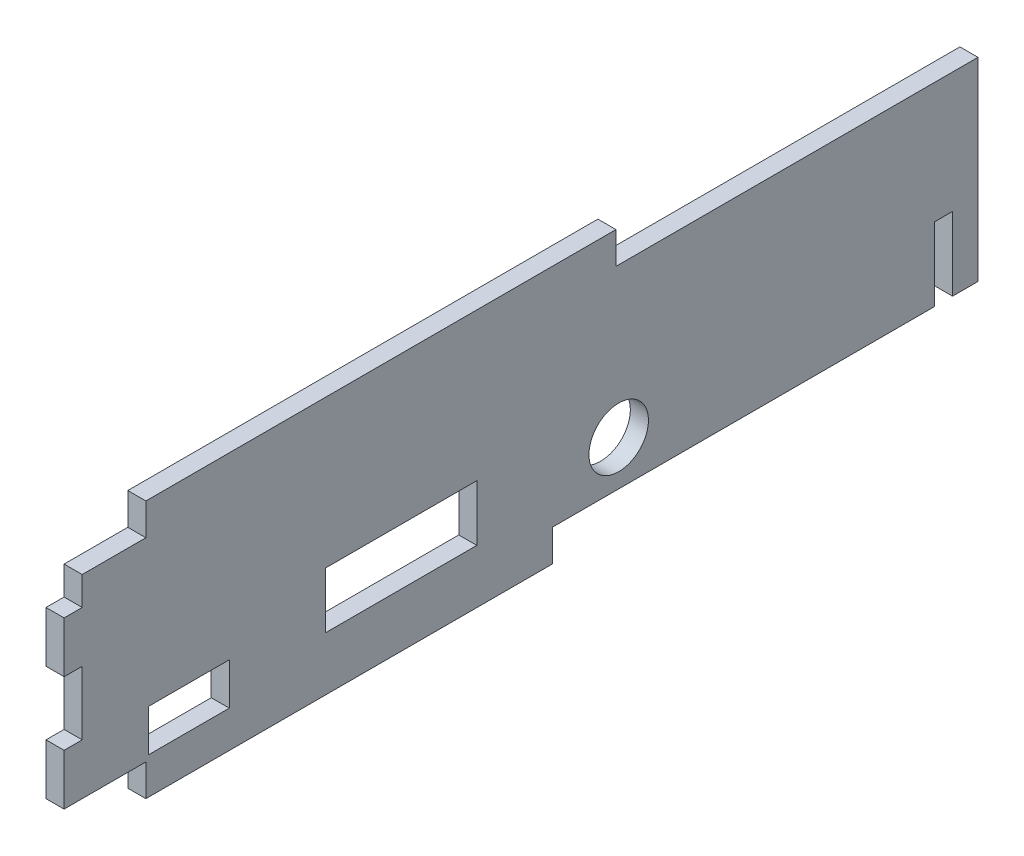
ISO-10303-21;
HEADER;
FILE_DESCRIPTION(('STEP AP214'),'2;1');
FILE_NAME('part.step','',(''),(''),'','','');
FILE_SCHEMA(('AUTOMOTIVE_DESIGN { 1 0 10303 214 1 1 1 1 }'));
ENDSEC;
DATA;
#1=APPLICATION_CONTEXT('core data for automotive mechanical design processes');
#2=APPLICATION_PROTOCOL_DEFINITION('international standard','automotive_design',2000,#1);
#3=PRODUCT_CONTEXT('',#1,'mechanical');
#4=PRODUCT('Part','Part','',(#3));
#5=PRODUCT_RELATED_PRODUCT_CATEGORY('part','',(#4));
#6=PRODUCT_DEFINITION_FORMATION('','',#4);
#7=PRODUCT_DEFINITION_CONTEXT('part definition',#1,'design');
#8=PRODUCT_DEFINITION('design','',#6,#7);
#9=PRODUCT_DEFINITION_SHAPE('','',#8);
#10=(LENGTH_UNIT() NAMED_UNIT(*) SI_UNIT(.MILLI.,.METRE.));
#11=(NAMED_UNIT(*) PLANE_ANGLE_UNIT() SI_UNIT($,.RADIAN.));
#12=(NAMED_UNIT(*) SI_UNIT($,.STERADIAN.) SOLID_ANGLE_UNIT());
#13=UNCERTAINTY_MEASURE_WITH_UNIT(LENGTH_MEASURE(1.E-05),#10,'distance_accuracy_value','');
#14=(GEOMETRIC_REPRESENTATION_CONTEXT(3) GLOBAL_UNCERTAINTY_ASSIGNED_CONTEXT((#13)) GLOBAL_UNIT_ASSIGNED_CONTEXT((#10,
#11,#12)) REPRESENTATION_CONTEXT('',''));
#15=CARTESIAN_POINT('',(0.,0.,0.));
#16=DIRECTION('',(0.,0.,1.));
#17=DIRECTION('',(1.,0.,0.));
#18=AXIS2_PLACEMENT_3D('',#15,#16,#17);
#19=CARTESIAN_POINT('',(1.8034,9.3853,0.));
#20=DIRECTION('',(0.,1.,0.));
#21=DIRECTION('',(0.,0.,1.));
#22=AXIS2_PLACEMENT_3D('',#19,#20,#21);
#23=PLANE('',#22);
#24=DIRECTION('',(0.,0.,-1.));
#25=VECTOR('',#24,1.);
#26=CARTESIAN_POINT('',(0.,9.3853,0.));
#27=LINE('',#26,#25);
#28=CARTESIAN_POINT('',(0.,9.3853,-6.6294));
#29=VERTEX_POINT('',#28);
#30=CARTESIAN_POINT('',(0.,9.3853,-14.6685));
#31=VERTEX_POINT('',#30);
#32=EDGE_CURVE('E338',#29,#31,#27,.T.);
#33=ORIENTED_EDGE('',*,*,#32,.T.);
#34=DIRECTION('',(-1.,0.,0.));
#35=VECTOR('',#34,1.);
#36=CARTESIAN_POINT('',(1.8034,9.3853,-14.6685));
#37=LINE('',#36,#35);
#38=CARTESIAN_POINT('',(1.8034,9.3853,-14.6685));
#39=VERTEX_POINT('',#38);
#40=EDGE_CURVE('E11',#39,#31,#37,.T.);
#41=ORIENTED_EDGE('',*,*,#40,.F.);
#42=DIRECTION('',(0.,0.,-1.));
#43=VECTOR('',#42,1.);
#44=CARTESIAN_POINT('',(1.8034,9.3853,0.));
#45=LINE('',#44,#43);
#46=CARTESIAN_POINT('',(1.8034,9.3853,-6.6294));
#47=VERTEX_POINT('',#46);
#48=EDGE_CURVE('E244',#47,#39,#45,.T.);
#49=ORIENTED_EDGE('',*,*,#48,.F.);
#50=DIRECTION('',(-1.,0.,0.));
#51=VECTOR('',#50,1.);
#52=CARTESIAN_POINT('',(1.8034,9.3853,-6.6294));
#53=LINE('',#52,#51);
#54=EDGE_CURVE('E52',#47,#29,#53,.T.);
#55=ORIENTED_EDGE('',*,*,#54,.T.);
#56=EDGE_LOOP('',(#33,#41,#49,#55));
#57=FACE_BOUND('',#56,.T.);
#58=ADVANCED_FACE('F33',(#57),#23,.F.);
#59=CARTESIAN_POINT('',(1.8034,0.,-14.6685));
#60=DIRECTION('',(0.,0.,-1.));
#61=DIRECTION('',(0.,1.,0.));
#62=AXIS2_PLACEMENT_3D('',#59,#60,#61);
#63=PLANE('',#62);
#64=DIRECTION('',(0.,-1.,0.));
#65=VECTOR('',#64,1.);
#66=CARTESIAN_POINT('',(0.,0.,-14.6685));
#67=LINE('',#66,#65);
#68=CARTESIAN_POINT('',(0.,5.207,-14.6685));
#69=VERTEX_POINT('',#68);
#70=EDGE_CURVE('E250',#31,#69,#67,.T.);
#71=ORIENTED_EDGE('',*,*,#70,.T.);
#72=DIRECTION('',(-1.,0.,0.));
#73=VECTOR('',#72,1.);
#74=CARTESIAN_POINT('',(1.8034,5.207,-14.6685));
#75=LINE('',#74,#73);
#76=CARTESIAN_POINT('',(1.8034,5.207,-14.6685));
#77=VERTEX_POINT('',#76);
#78=EDGE_CURVE('E43',#77,#69,#75,.T.);
#79=ORIENTED_EDGE('',*,*,#78,.F.);
#80=DIRECTION('',(0.,-1.,0.));
#81=VECTOR('',#80,1.);
#82=CARTESIAN_POINT('',(1.8034,0.,-14.6685));
#83=LINE('',#82,#81);
#84=EDGE_CURVE('E238',#39,#77,#83,.T.);
#85=ORIENTED_EDGE('',*,*,#84,.F.);
#86=ORIENTED_EDGE('',*,*,#40,.T.);
#87=EDGE_LOOP('',(#71,#79,#85,#86));
#88=FACE_BOUND('',#87,.T.);
#89=ADVANCED_FACE('F249',(#88),#63,.F.);
#90=CARTESIAN_POINT('',(1.8034,5.207,0.));
#91=DIRECTION('',(0.,1.,0.));
#92=DIRECTION('',(0.,0.,1.));
#93=AXIS2_PLACEMENT_3D('',#90,#91,#92);
#94=PLANE('',#93);
#95=DIRECTION('',(0.,0.,-1.));
#96=VECTOR('',#95,1.);
#97=CARTESIAN_POINT('',(0.,5.207,0.));
#98=LINE('',#97,#96);
#99=CARTESIAN_POINT('',(0.,5.207,-6.6294));
#100=VERTEX_POINT('',#99);
#101=EDGE_CURVE('E341',#100,#69,#98,.T.);
#102=ORIENTED_EDGE('',*,*,#101,.F.);
#103=DIRECTION('',(-1.,0.,0.));
#104=VECTOR('',#103,1.);
#105=CARTESIAN_POINT('',(1.8034,5.207,-6.6294));
#106=LINE('',#105,#104);
#107=CARTESIAN_POINT('',(1.8034,5.207,-6.6294));
#108=VERTEX_POINT('',#107);
#109=EDGE_CURVE('E144',#108,#100,#106,.T.);
#110=ORIENTED_EDGE('',*,*,#109,.F.);
#111=DIRECTION('',(0.,0.,-1.));
#112=VECTOR('',#111,1.);
#113=CARTESIAN_POINT('',(1.8034,5.207,0.));
#114=LINE('',#113,#112);
#115=EDGE_CURVE('E243',#108,#77,#114,.T.);
#116=ORIENTED_EDGE('',*,*,#115,.T.);
#117=ORIENTED_EDGE('',*,*,#78,.T.);
#118=EDGE_LOOP('',(#102,#110,#116,#117));
#119=FACE_BOUND('',#118,.T.);
#120=ADVANCED_FACE('F254',(#119),#94,.T.);
#121=CARTESIAN_POINT('',(1.8034,0.,-39.3446));
#122=DIRECTION('',(0.,0.,1.));
#123=DIRECTION('',(0.,-1.,0.));
#124=AXIS2_PLACEMENT_3D('',#121,#122,#123);
#125=PLANE('',#124);
#126=DIRECTION('',(0.,1.,0.));
#127=VECTOR('',#126,1.);
#128=CARTESIAN_POINT('',(0.,0.,-39.3446));
#129=LINE('',#128,#127);
#130=CARTESIAN_POINT('',(0.,6.9215,-39.3446));
#131=VERTEX_POINT('',#130);
#132=CARTESIAN_POINT('',(0.,12.5095,-39.3446));
#133=VERTEX_POINT('',#132);
#134=EDGE_CURVE('E326',#131,#133,#129,.T.);
#135=ORIENTED_EDGE('',*,*,#134,.F.);
#136=DIRECTION('',(-1.,0.,0.));
#137=VECTOR('',#136,1.);
#138=CARTESIAN_POINT('',(1.8034,6.9215,-39.3446));
#139=LINE('',#138,#137);
#140=CARTESIAN_POINT('',(1.8034,6.9215,-39.3446));
#141=VERTEX_POINT('',#140);
#142=EDGE_CURVE('E348',#141,#131,#139,.T.);
#143=ORIENTED_EDGE('',*,*,#142,.F.);
#144=DIRECTION('',(0.,1.,0.));
#145=VECTOR('',#144,1.);
#146=CARTESIAN_POINT('',(1.8034,0.,-39.3446));
#147=LINE('',#146,#145);
#148=CARTESIAN_POINT('',(1.8034,12.5095,-39.3446));
#149=VERTEX_POINT('',#148);
#150=EDGE_CURVE('E838',#141,#149,#147,.T.);
#151=ORIENTED_EDGE('',*,*,#150,.T.);
#152=DIRECTION('',(-1.,0.,0.));
#153=VECTOR('',#152,1.);
#154=CARTESIAN_POINT('',(1.8034,12.5095,-39.3446));
#155=LINE('',#154,#153);
#156=EDGE_CURVE('E350',#149,#133,#155,.T.);
#157=ORIENTED_EDGE('',*,*,#156,.T.);
#158=EDGE_LOOP('',(#135,#143,#151,#157));
#159=FACE_BOUND('',#158,.T.);
#160=ADVANCED_FACE('F543',(#159),#125,.T.);
#161=CARTESIAN_POINT('',(1.8034,6.9215,0.));
#162=DIRECTION('',(0.,1.,0.));
#163=DIRECTION('',(0.,0.,1.));
#164=AXIS2_PLACEMENT_3D('',#161,#162,#163);
#165=PLANE('',#164);
#166=DIRECTION('',(0.,0.,-1.));
#167=VECTOR('',#166,1.);
#168=CARTESIAN_POINT('',(0.,6.9215,0.));
#169=LINE('',#168,#167);
#170=CARTESIAN_POINT('',(0.,6.9215,-24.257));
#171=VERTEX_POINT('',#170);
#172=EDGE_CURVE('E329',#171,#131,#169,.T.);
#173=ORIENTED_EDGE('',*,*,#172,.F.);
#174=DIRECTION('',(-1.,0.,0.));
#175=VECTOR('',#174,1.);
#176=CARTESIAN_POINT('',(1.8034,6.9215,-24.257));
#177=LINE('',#176,#175);
#178=CARTESIAN_POINT('',(1.8034,6.9215,-24.257));
#179=VERTEX_POINT('',#178);
#180=EDGE_CURVE('E355',#179,#171,#177,.T.);
#181=ORIENTED_EDGE('',*,*,#180,.F.);
#182=DIRECTION('',(0.,0.,-1.));
#183=VECTOR('',#182,1.);
#184=CARTESIAN_POINT('',(1.8034,6.9215,0.));
#185=LINE('',#184,#183);
#186=EDGE_CURVE('E841',#179,#141,#185,.T.);
#187=ORIENTED_EDGE('',*,*,#186,.T.);
#188=ORIENTED_EDGE('',*,*,#142,.T.);
#189=EDGE_LOOP('',(#173,#181,#187,#188));
#190=FACE_BOUND('',#189,.T.);
#191=ADVANCED_FACE('F539',(#190),#165,.T.);
#192=CARTESIAN_POINT('',(1.8034,0.,-24.257));
#193=DIRECTION('',(0.,0.,1.));
#194=DIRECTION('',(0.,-1.,0.));
#195=AXIS2_PLACEMENT_3D('',#192,#193,#194);
#196=PLANE('',#195);
#197=DIRECTION('',(0.,1.,0.));
#198=VECTOR('',#197,1.);
#199=CARTESIAN_POINT('',(0.,0.,-24.257));
#200=LINE('',#199,#198);
#201=CARTESIAN_POINT('',(0.,12.5095,-24.257));
#202=VERTEX_POINT('',#201);
#203=EDGE_CURVE('E332',#171,#202,#200,.T.);
#204=ORIENTED_EDGE('',*,*,#203,.T.);
#205=DIRECTION('',(-1.,0.,0.));
#206=VECTOR('',#205,1.);
#207=CARTESIAN_POINT('',(1.8034,12.5095,-24.257));
#208=LINE('',#207,#206);
#209=CARTESIAN_POINT('',(1.8034,12.5095,-24.257));
#210=VERTEX_POINT('',#209);
#211=EDGE_CURVE('E352',#210,#202,#208,.T.);
#212=ORIENTED_EDGE('',*,*,#211,.F.);
#213=DIRECTION('',(0.,1.,0.));
#214=VECTOR('',#213,1.);
#215=CARTESIAN_POINT('',(1.8034,0.,-24.257));
#216=LINE('',#215,#214);
#217=EDGE_CURVE('E849',#179,#210,#216,.T.);
#218=ORIENTED_EDGE('',*,*,#217,.F.);
#219=ORIENTED_EDGE('',*,*,#180,.T.);
#220=EDGE_LOOP('',(#204,#212,#218,#219));
#221=FACE_BOUND('',#220,.T.);
#222=ADVANCED_FACE('F536',(#221),#196,.F.);
#223=CARTESIAN_POINT('',(1.8034,4.7244,0.));
#224=DIRECTION('',(0.,-1.,0.));
#225=DIRECTION('',(0.,0.,-1.));
#226=AXIS2_PLACEMENT_3D('',#223,#224,#225);
#227=PLANE('',#226);
#228=DIRECTION('',(0.,0.,1.));
#229=VECTOR('',#228,1.);
#230=CARTESIAN_POINT('',(0.,4.7244,0.));
#231=LINE('',#230,#229);
#232=CARTESIAN_POINT('',(0.,4.7244,-6.35));
#233=VERTEX_POINT('',#232);
#234=CARTESIAN_POINT('',(0.,4.72439999999999,1.8034));
#235=VERTEX_POINT('',#234);
#236=EDGE_CURVE('E264',#233,#235,#231,.T.);
#237=ORIENTED_EDGE('',*,*,#236,.F.);
#238=DIRECTION('',(-1.,0.,0.));
#239=VECTOR('',#238,1.);
#240=CARTESIAN_POINT('',(1.8034,4.7244,-6.35));
#241=LINE('',#240,#239);
#242=CARTESIAN_POINT('',(1.8034,4.7244,-6.35));
#243=VERTEX_POINT('',#242);
#244=EDGE_CURVE('E37',#243,#233,#241,.T.);
#245=ORIENTED_EDGE('',*,*,#244,.F.);
#246=DIRECTION('',(0.,0.,1.));
#247=VECTOR('',#246,1.);
#248=CARTESIAN_POINT('',(1.8034,4.7244,0.));
#249=LINE('',#248,#247);
#250=CARTESIAN_POINT('',(1.8034,4.72439999999999,1.8034));
#251=VERTEX_POINT('',#250);
#252=EDGE_CURVE('E420',#243,#251,#249,.T.);
#253=ORIENTED_EDGE('',*,*,#252,.T.);
#254=DIRECTION('',(-1.,0.,0.));
#255=VECTOR('',#254,1.);
#256=CARTESIAN_POINT('',(1.8034,4.72439999999999,1.8034));
#257=LINE('',#256,#255);
#258=EDGE_CURVE('E257',#251,#235,#257,.T.);
#259=ORIENTED_EDGE('',*,*,#258,.T.);
#260=EDGE_LOOP('',(#237,#245,#253,#259));
#261=FACE_BOUND('',#260,.T.);
#262=ADVANCED_FACE('F418',(#261),#227,.T.);
#263=CARTESIAN_POINT('',(1.8034,0.,-6.35));
#264=DIRECTION('',(0.,0.,-1.));
#265=DIRECTION('',(-1.,0.,0.));
#266=AXIS2_PLACEMENT_3D('',#263,#264,#265);
#267=PLANE('',#266);
#268=DIRECTION('',(0.,-1.,0.));
#269=VECTOR('',#268,1.);
#270=CARTESIAN_POINT('',(0.,0.,-6.35));
#271=LINE('',#270,#269);
#272=CARTESIAN_POINT('',(0.,1.5494,-6.35));
#273=VERTEX_POINT('',#272);
#274=EDGE_CURVE('E267',#233,#273,#271,.T.);
#275=ORIENTED_EDGE('',*,*,#274,.T.);
#276=DIRECTION('',(-1.,0.,0.));
#277=VECTOR('',#276,1.);
#278=CARTESIAN_POINT('',(1.8034,1.5494,-6.35));
#279=LINE('',#278,#277);
#280=CARTESIAN_POINT('',(1.8034,1.5494,-6.35));
#281=VERTEX_POINT('',#280);
#282=EDGE_CURVE('E404',#281,#273,#279,.T.);
#283=ORIENTED_EDGE('',*,*,#282,.F.);
#284=DIRECTION('',(0.,-1.,0.));
#285=VECTOR('',#284,1.);
#286=CARTESIAN_POINT('',(1.8034,0.,-6.35));
#287=LINE('',#286,#285);
#288=EDGE_CURVE('E412',#243,#281,#287,.T.);
#289=ORIENTED_EDGE('',*,*,#288,.F.);
#290=ORIENTED_EDGE('',*,*,#244,.T.);
#291=EDGE_LOOP('',(#275,#283,#289,#290));
#292=FACE_BOUND('',#291,.T.);
#293=ADVANCED_FACE('F410',(#292),#267,.F.);
#294=CARTESIAN_POINT('',(1.8034,1.5494,0.));
#295=DIRECTION('',(0.,1.,0.));
#296=DIRECTION('',(0.,0.,1.));
#297=AXIS2_PLACEMENT_3D('',#294,#295,#296);
#298=PLANE('',#297);
#299=DIRECTION('',(0.,0.,-1.));
#300=VECTOR('',#299,1.);
#301=CARTESIAN_POINT('',(0.,1.5494,0.));
#302=LINE('',#301,#300);
#303=CARTESIAN_POINT('',(0.,1.5494,-46.863));
#304=VERTEX_POINT('',#303);
#305=EDGE_CURVE('E270',#273,#304,#302,.T.);
#306=ORIENTED_EDGE('',*,*,#305,.T.);
#307=DIRECTION('',(-1.,0.,0.));
#308=VECTOR('',#307,1.);
#309=CARTESIAN_POINT('',(1.8034,1.5494,-46.863));
#310=LINE('',#309,#308);
#311=CARTESIAN_POINT('',(1.8034,1.5494,-46.863));
#312=VERTEX_POINT('',#311);
#313=EDGE_CURVE('E402',#312,#304,#310,.T.);
#314=ORIENTED_EDGE('',*,*,#313,.F.);
#315=DIRECTION('',(0.,0.,-1.));
#316=VECTOR('',#315,1.);
#317=CARTESIAN_POINT('',(1.8034,1.5494,0.));
#318=LINE('',#317,#316);
#319=EDGE_CURVE('E881',#281,#312,#318,.T.);
#320=ORIENTED_EDGE('',*,*,#319,.F.);
#321=ORIENTED_EDGE('',*,*,#282,.T.);
#322=EDGE_LOOP('',(#306,#314,#320,#321));
#323=FACE_BOUND('',#322,.T.);
#324=ADVANCED_FACE('F515',(#323),#298,.F.);
#325=CARTESIAN_POINT('',(1.8034,0.,-46.863));
#326=DIRECTION('',(0.,0.,1.));
#327=DIRECTION('',(1.,0.,0.));
#328=AXIS2_PLACEMENT_3D('',#325,#326,#327);
#329=PLANE('',#328);
#330=DIRECTION('',(0.,1.,0.));
#331=VECTOR('',#330,1.);
#332=CARTESIAN_POINT('',(0.,0.,-46.863));
#333=LINE('',#332,#331);
#334=CARTESIAN_POINT('',(0.,4.7244,-46.863));
#335=VERTEX_POINT('',#334);
#336=EDGE_CURVE('E273',#304,#335,#333,.T.);
#337=ORIENTED_EDGE('',*,*,#336,.T.);
#338=DIRECTION('',(-1.,0.,0.));
#339=VECTOR('',#338,1.);
#340=CARTESIAN_POINT('',(1.8034,4.7244,-46.863));
#341=LINE('',#340,#339);
#342=CARTESIAN_POINT('',(1.8034,4.7244,-46.863));
#343=VERTEX_POINT('',#342);
#344=EDGE_CURVE('E399',#343,#335,#341,.T.);
#345=ORIENTED_EDGE('',*,*,#344,.F.);
#346=DIRECTION('',(0.,1.,0.));
#347=VECTOR('',#346,1.);
#348=CARTESIAN_POINT('',(1.8034,0.,-46.863));
#349=LINE('',#348,#347);
#350=EDGE_CURVE('E513',#312,#343,#349,.T.);
#351=ORIENTED_EDGE('',*,*,#350,.F.);
#352=ORIENTED_EDGE('',*,*,#313,.T.);
#353=EDGE_LOOP('',(#337,#345,#351,#352));
#354=FACE_BOUND('',#353,.T.);
#355=ADVANCED_FACE('F511',(#354),#329,.F.);
#356=CARTESIAN_POINT('',(1.8034,4.7244,0.));
#357=DIRECTION('',(0.,1.,0.));
#358=DIRECTION('',(0.,0.,1.));
#359=AXIS2_PLACEMENT_3D('',#356,#357,#358);
#360=PLANE('',#359);
#361=DIRECTION('',(0.,0.,-1.));
#362=VECTOR('',#361,1.);
#363=CARTESIAN_POINT('',(0.,4.7244,0.));
#364=LINE('',#363,#362);
#365=CARTESIAN_POINT('',(0.,4.7244,-84.963));
#366=VERTEX_POINT('',#365);
#367=EDGE_CURVE('E276',#335,#366,#364,.T.);
#368=ORIENTED_EDGE('',*,*,#367,.T.);
#369=DIRECTION('',(-1.,0.,0.));
#370=VECTOR('',#369,1.);
#371=CARTESIAN_POINT('',(1.8034,4.7244,-84.963));
#372=LINE('',#371,#370);
#373=CARTESIAN_POINT('',(1.8034,4.7244,-84.963));
#374=VERTEX_POINT('',#373);
#375=EDGE_CURVE('E397',#374,#366,#372,.T.);
#376=ORIENTED_EDGE('',*,*,#375,.F.);
#377=DIRECTION('',(0.,0.,-1.));
#378=VECTOR('',#377,1.);
#379=CARTESIAN_POINT('',(1.8034,4.7244,0.));
#380=LINE('',#379,#378);
#381=EDGE_CURVE('E878',#343,#374,#380,.T.);
#382=ORIENTED_EDGE('',*,*,#381,.F.);
#383=ORIENTED_EDGE('',*,*,#344,.T.);
#384=EDGE_LOOP('',(#368,#376,#382,#383));
#385=FACE_BOUND('',#384,.T.);
#386=ADVANCED_FACE('F507',(#385),#360,.F.);
#387=CARTESIAN_POINT('',(1.8034,0.,-84.963));
#388=DIRECTION('',(0.,0.,-1.));
#389=DIRECTION('',(-1.,0.,0.));
#390=AXIS2_PLACEMENT_3D('',#387,#388,#389);
#391=PLANE('',#390);
#392=DIRECTION('',(0.,-1.,0.));
#393=VECTOR('',#392,1.);
#394=CARTESIAN_POINT('',(0.,0.,-84.963));
#395=LINE('',#394,#393);
#396=CARTESIAN_POINT('',(0.,12.0396,-84.963));
#397=VERTEX_POINT('',#396);
#398=EDGE_CURVE('E279',#397,#366,#395,.T.);
#399=ORIENTED_EDGE('',*,*,#398,.F.);
#400=DIRECTION('',(-1.,0.,0.));
#401=VECTOR('',#400,1.);
#402=CARTESIAN_POINT('',(1.8034,12.0396,-84.963));
#403=LINE('',#402,#401);
#404=CARTESIAN_POINT('',(1.8034,12.0396,-84.963));
#405=VERTEX_POINT('',#404);
#406=EDGE_CURVE('E395',#405,#397,#403,.T.);
#407=ORIENTED_EDGE('',*,*,#406,.F.);
#408=DIRECTION('',(0.,-1.,0.));
#409=VECTOR('',#408,1.);
#410=CARTESIAN_POINT('',(1.8034,0.,-84.963));
#411=LINE('',#410,#409);
#412=EDGE_CURVE('E505',#405,#374,#411,.T.);
#413=ORIENTED_EDGE('',*,*,#412,.T.);
#414=ORIENTED_EDGE('',*,*,#375,.T.);
#415=EDGE_LOOP('',(#399,#407,#413,#414));
#416=FACE_BOUND('',#415,.T.);
#417=ADVANCED_FACE('F500',(#416),#391,.T.);
#418=CARTESIAN_POINT('',(1.8034,12.0396,0.));
#419=DIRECTION('',(0.,1.,0.));
#420=DIRECTION('',(0.,0.,1.));
#421=AXIS2_PLACEMENT_3D('',#418,#419,#420);
#422=PLANE('',#421);
#423=DIRECTION('',(0.,0.,-1.));
#424=VECTOR('',#423,1.);
#425=CARTESIAN_POINT('',(0.,12.0396,0.));
#426=LINE('',#425,#424);
#427=CARTESIAN_POINT('',(0.,12.0396,-86.7664));
#428=VERTEX_POINT('',#427);
#429=EDGE_CURVE('E282',#397,#428,#426,.T.);
#430=ORIENTED_EDGE('',*,*,#429,.T.);
#431=DIRECTION('',(-1.,0.,0.));
#432=VECTOR('',#431,1.);
#433=CARTESIAN_POINT('',(1.8034,12.0396,-86.7664));
#434=LINE('',#433,#432);
#435=CARTESIAN_POINT('',(1.8034,12.0396,-86.7664));
#436=VERTEX_POINT('',#435);
#437=EDGE_CURVE('E392',#436,#428,#434,.T.);
#438=ORIENTED_EDGE('',*,*,#437,.F.);
#439=DIRECTION('',(0.,0.,-1.));
#440=VECTOR('',#439,1.);
#441=CARTESIAN_POINT('',(1.8034,12.0396,0.));
#442=LINE('',#441,#440);
#443=EDGE_CURVE('E874',#405,#436,#442,.T.);
#444=ORIENTED_EDGE('',*,*,#443,.F.);
#445=ORIENTED_EDGE('',*,*,#406,.T.);
#446=EDGE_LOOP('',(#430,#438,#444,#445));
#447=FACE_BOUND('',#446,.T.);
#448=ADVANCED_FACE('F575',(#447),#422,.F.);
#449=CARTESIAN_POINT('',(1.8034,0.,-86.7664));
#450=DIRECTION('',(0.,0.,-1.));
#451=DIRECTION('',(0.,1.,0.));
#452=AXIS2_PLACEMENT_3D('',#449,#450,#451);
#453=PLANE('',#452);
#454=DIRECTION('',(0.,-1.,0.));
#455=VECTOR('',#454,1.);
#456=CARTESIAN_POINT('',(0.,0.,-86.7664));
#457=LINE('',#456,#455);
#458=CARTESIAN_POINT('',(0.,4.72440000000001,-86.7664));
#459=VERTEX_POINT('',#458);
#460=EDGE_CURVE('E285',#428,#459,#457,.T.);
#461=ORIENTED_EDGE('',*,*,#460,.T.);
#462=DIRECTION('',(-1.,0.,0.));
#463=VECTOR('',#462,1.);
#464=CARTESIAN_POINT('',(1.8034,4.72440000000001,-86.7664));
#465=LINE('',#464,#463);
#466=CARTESIAN_POINT('',(1.8034,4.72440000000001,-86.7664));
#467=VERTEX_POINT('',#466);
#468=EDGE_CURVE('E389',#467,#459,#465,.T.);
#469=ORIENTED_EDGE('',*,*,#468,.F.);
#470=DIRECTION('',(0.,-1.,0.));
#471=VECTOR('',#470,1.);
#472=CARTESIAN_POINT('',(1.8034,0.,-86.7664));
#473=LINE('',#472,#471);
#474=EDGE_CURVE('E872',#436,#467,#473,.T.);
#475=ORIENTED_EDGE('',*,*,#474,.F.);
#476=ORIENTED_EDGE('',*,*,#437,.T.);
#477=EDGE_LOOP('',(#461,#469,#475,#476));
#478=FACE_BOUND('',#477,.T.);
#479=ADVANCED_FACE('F494',(#478),#453,.F.);
#480=CARTESIAN_POINT('',(1.8034,4.72440000000001,0.));
#481=DIRECTION('',(0.,1.,0.));
#482=DIRECTION('',(0.,0.,1.));
#483=AXIS2_PLACEMENT_3D('',#480,#481,#482);
#484=PLANE('',#483);
#485=DIRECTION('',(0.,0.,-1.));
#486=VECTOR('',#485,1.);
#487=CARTESIAN_POINT('',(0.,4.72440000000001,0.));
#488=LINE('',#487,#486);
#489=CARTESIAN_POINT('',(0.,4.72440000000001,-89.3064));
#490=VERTEX_POINT('',#489);
#491=EDGE_CURVE('E288',#459,#490,#488,.T.);
#492=ORIENTED_EDGE('',*,*,#491,.T.);
#493=DIRECTION('',(-1.,0.,0.));
#494=VECTOR('',#493,1.);
#495=CARTESIAN_POINT('',(1.8034,4.72440000000001,-89.3064));
#496=LINE('',#495,#494);
#497=CARTESIAN_POINT('',(1.8034,4.72440000000001,-89.3064));
#498=VERTEX_POINT('',#497);
#499=EDGE_CURVE('E387',#498,#490,#496,.T.);
#500=ORIENTED_EDGE('',*,*,#499,.F.);
#501=DIRECTION('',(0.,0.,-1.));
#502=VECTOR('',#501,1.);
#503=CARTESIAN_POINT('',(1.8034,4.72440000000001,0.));
#504=LINE('',#503,#502);
#505=EDGE_CURVE('E491',#467,#498,#504,.T.);
#506=ORIENTED_EDGE('',*,*,#505,.F.);
#507=ORIENTED_EDGE('',*,*,#468,.T.);
#508=EDGE_LOOP('',(#492,#500,#506,#507));
#509=FACE_BOUND('',#508,.T.);
#510=ADVANCED_FACE('F489',(#509),#484,.F.);
#511=CARTESIAN_POINT('',(1.8034,0.,-89.3064));
#512=DIRECTION('',(0.,0.,-1.));
#513=DIRECTION('',(-1.,0.,0.));
#514=AXIS2_PLACEMENT_3D('',#511,#512,#513);
#515=PLANE('',#514);
#516=DIRECTION('',(0.,-1.,0.));
#517=VECTOR('',#516,1.);
#518=CARTESIAN_POINT('',(0.,0.,-89.3064));
#519=LINE('',#518,#517);
#520=CARTESIAN_POINT('',(0.,24.0792,-89.3064));
#521=VERTEX_POINT('',#520);
#522=EDGE_CURVE('E291',#521,#490,#519,.T.);
#523=ORIENTED_EDGE('',*,*,#522,.F.);
#524=DIRECTION('',(-1.,0.,0.));
#525=VECTOR('',#524,1.);
#526=CARTESIAN_POINT('',(1.8034,24.0792,-89.3064));
#527=LINE('',#526,#525);
#528=CARTESIAN_POINT('',(1.8034,24.0792,-89.3064));
#529=VERTEX_POINT('',#528);
#530=EDGE_CURVE('E385',#529,#521,#527,.T.);
#531=ORIENTED_EDGE('',*,*,#530,.F.);
#532=DIRECTION('',(0.,-1.,0.));
#533=VECTOR('',#532,1.);
#534=CARTESIAN_POINT('',(1.8034,0.,-89.3064));
#535=LINE('',#534,#533);
#536=EDGE_CURVE('E487',#529,#498,#535,.T.);
#537=ORIENTED_EDGE('',*,*,#536,.T.);
#538=ORIENTED_EDGE('',*,*,#499,.T.);
#539=EDGE_LOOP('',(#523,#531,#537,#538));
#540=FACE_BOUND('',#539,.T.);
#541=ADVANCED_FACE('F483',(#540),#515,.T.);
#542=CARTESIAN_POINT('',(1.8034,24.0792,0.));
#543=DIRECTION('',(0.,1.,0.));
#544=DIRECTION('',(0.,0.,1.));
#545=AXIS2_PLACEMENT_3D('',#542,#543,#544);
#546=PLANE('',#545);
#547=DIRECTION('',(0.,0.,-1.));
#548=VECTOR('',#547,1.);
#549=CARTESIAN_POINT('',(0.,24.0792,0.));
#550=LINE('',#549,#548);
#551=CARTESIAN_POINT('',(0.,24.0792,-53.213));
#552=VERTEX_POINT('',#551);
#553=EDGE_CURVE('E294',#552,#521,#550,.T.);
#554=ORIENTED_EDGE('',*,*,#553,.F.);
#555=DIRECTION('',(-1.,0.,0.));
#556=VECTOR('',#555,1.);
#557=CARTESIAN_POINT('',(1.8034,24.0792,-53.213));
#558=LINE('',#557,#556);
#559=CARTESIAN_POINT('',(1.8034,24.0792,-53.213));
#560=VERTEX_POINT('',#559);
#561=EDGE_CURVE('E383',#560,#552,#558,.T.);
#562=ORIENTED_EDGE('',*,*,#561,.F.);
#563=DIRECTION('',(0.,0.,-1.));
#564=VECTOR('',#563,1.);
#565=CARTESIAN_POINT('',(1.8034,24.0792,0.));
#566=LINE('',#565,#564);
#567=EDGE_CURVE('E868',#560,#529,#566,.T.);
#568=ORIENTED_EDGE('',*,*,#567,.T.);
#569=ORIENTED_EDGE('',*,*,#530,.T.);
#570=EDGE_LOOP('',(#554,#562,#568,#569));
#571=FACE_BOUND('',#570,.T.);
#572=ADVANCED_FACE('F480',(#571),#546,.T.);
#573=CARTESIAN_POINT('',(1.8034,0.,-53.213));
#574=DIRECTION('',(0.,0.,-1.));
#575=DIRECTION('',(-1.,0.,0.));
#576=AXIS2_PLACEMENT_3D('',#573,#574,#575);
#577=PLANE('',#576);
#578=DIRECTION('',(0.,-1.,0.));
#579=VECTOR('',#578,1.);
#580=CARTESIAN_POINT('',(0.,0.,-53.213));
#581=LINE('',#580,#579);
#582=CARTESIAN_POINT('',(0.,27.2542,-53.213));
#583=VERTEX_POINT('',#582);
#584=EDGE_CURVE('E297',#583,#552,#581,.T.);
#585=ORIENTED_EDGE('',*,*,#584,.F.);
#586=DIRECTION('',(-1.,0.,0.));
#587=VECTOR('',#586,1.);
#588=CARTESIAN_POINT('',(1.8034,27.2542,-53.213));
#589=LINE('',#588,#587);
#590=CARTESIAN_POINT('',(1.8034,27.2542,-53.213));
#591=VERTEX_POINT('',#590);
#592=EDGE_CURVE('E381',#591,#583,#589,.T.);
#593=ORIENTED_EDGE('',*,*,#592,.F.);
#594=DIRECTION('',(0.,-1.,0.));
#595=VECTOR('',#594,1.);
#596=CARTESIAN_POINT('',(1.8034,0.,-53.213));
#597=LINE('',#596,#595);
#598=EDGE_CURVE('E476',#591,#560,#597,.T.);
#599=ORIENTED_EDGE('',*,*,#598,.T.);
#600=ORIENTED_EDGE('',*,*,#561,.T.);
#601=EDGE_LOOP('',(#585,#593,#599,#600));
#602=FACE_BOUND('',#601,.T.);
#603=ADVANCED_FACE('F474',(#602),#577,.T.);
#604=CARTESIAN_POINT('',(1.8034,27.2542,0.));
#605=DIRECTION('',(0.,1.,0.));
#606=DIRECTION('',(0.,0.,1.));
#607=AXIS2_PLACEMENT_3D('',#604,#605,#606);
#608=PLANE('',#607);
#609=DIRECTION('',(0.,0.,-1.));
#610=VECTOR('',#609,1.);
#611=CARTESIAN_POINT('',(0.,27.2542,0.));
#612=LINE('',#611,#610);
#613=CARTESIAN_POINT('',(0.,27.2542,-6.35));
#614=VERTEX_POINT('',#613);
#615=EDGE_CURVE('E301',#614,#583,#612,.T.);
#616=ORIENTED_EDGE('',*,*,#615,.F.);
#617=DIRECTION('',(-1.,0.,0.));
#618=VECTOR('',#617,1.);
#619=CARTESIAN_POINT('',(1.8034,27.2542,-6.35));
#620=LINE('',#619,#618);
#621=CARTESIAN_POINT('',(1.8034,27.2542,-6.35));
#622=VERTEX_POINT('',#621);
#623=EDGE_CURVE('E379',#622,#614,#620,.T.);
#624=ORIENTED_EDGE('',*,*,#623,.F.);
#625=DIRECTION('',(0.,0.,-1.));
#626=VECTOR('',#625,1.);
#627=CARTESIAN_POINT('',(1.8034,27.2542,0.));
#628=LINE('',#627,#626);
#629=EDGE_CURVE('E470',#622,#591,#628,.T.);
#630=ORIENTED_EDGE('',*,*,#629,.T.);
#631=ORIENTED_EDGE('',*,*,#592,.T.);
#632=EDGE_LOOP('',(#616,#624,#630,#631));
#633=FACE_BOUND('',#632,.T.);
#634=ADVANCED_FACE('F467',(#633),#608,.T.);
#635=CARTESIAN_POINT('',(1.8034,0.,-6.34999999999998));
#636=DIRECTION('',(0.,0.,1.));
#637=DIRECTION('',(0.,-1.,0.));
#638=AXIS2_PLACEMENT_3D('',#635,#636,#637);
#639=PLANE('',#638);
#640=DIRECTION('',(0.,1.,0.));
#641=VECTOR('',#640,1.);
#642=CARTESIAN_POINT('',(0.,0.,-6.34999999999998));
#643=LINE('',#642,#641);
#644=CARTESIAN_POINT('',(0.,24.0792,-6.35));
#645=VERTEX_POINT('',#644);
#646=EDGE_CURVE('E304',#645,#614,#643,.T.);
#647=ORIENTED_EDGE('',*,*,#646,.F.);
#648=DIRECTION('',(-1.,0.,0.));
#649=VECTOR('',#648,1.);
#650=CARTESIAN_POINT('',(1.8034,24.0792,-6.35));
#651=LINE('',#650,#649);
#652=CARTESIAN_POINT('',(1.8034,24.0792,-6.35));
#653=VERTEX_POINT('',#652);
#654=EDGE_CURVE('E377',#653,#645,#651,.T.);
#655=ORIENTED_EDGE('',*,*,#654,.F.);
#656=DIRECTION('',(0.,1.,0.));
#657=VECTOR('',#656,1.);
#658=CARTESIAN_POINT('',(1.8034,0.,-6.34999999999998));
#659=LINE('',#658,#657);
#660=EDGE_CURVE('E864',#653,#622,#659,.T.);
#661=ORIENTED_EDGE('',*,*,#660,.T.);
#662=ORIENTED_EDGE('',*,*,#623,.T.);
#663=EDGE_LOOP('',(#647,#655,#661,#662));
#664=FACE_BOUND('',#663,.T.);
#665=ADVANCED_FACE('F463',(#664),#639,.T.);
#666=CARTESIAN_POINT('',(0.,24.0792,0.));
#667=VERTEX_POINT('',#666);
#668=EDGE_CURVE('E298',#667,#645,#550,.T.);
#669=ORIENTED_EDGE('',*,*,#668,.F.);
#670=DIRECTION('',(-1.,0.,0.));
#671=VECTOR('',#670,1.);
#672=CARTESIAN_POINT('',(1.8034,24.0792,0.));
#673=LINE('',#672,#671);
#674=CARTESIAN_POINT('',(1.8034,24.0792,0.));
#675=VERTEX_POINT('',#674);
#676=EDGE_CURVE('E375',#675,#667,#673,.T.);
#677=ORIENTED_EDGE('',*,*,#676,.F.);
#678=EDGE_CURVE('E459',#675,#653,#566,.T.);
#679=ORIENTED_EDGE('',*,*,#678,.T.);
#680=ORIENTED_EDGE('',*,*,#654,.T.);
#681=EDGE_LOOP('',(#669,#677,#679,#680));
#682=FACE_BOUND('',#681,.T.);
#683=ADVANCED_FACE('F454',(#682),#546,.T.);
#684=CARTESIAN_POINT('',(1.8034,0.,0.));
#685=DIRECTION('',(0.,0.,-1.));
#686=DIRECTION('',(0.,1.,0.));
#687=AXIS2_PLACEMENT_3D('',#684,#685,#686);
#688=PLANE('',#687);
#689=DIRECTION('',(0.,-1.,0.));
#690=VECTOR('',#689,1.);
#691=CARTESIAN_POINT('',(0.,0.,0.));
#692=LINE('',#691,#690);
#693=CARTESIAN_POINT('',(0.,21.2344,0.));
#694=VERTEX_POINT('',#693);
#695=EDGE_CURVE('E307',#667,#694,#692,.T.);
#696=ORIENTED_EDGE('',*,*,#695,.T.);
#697=DIRECTION('',(-1.,0.,0.));
#698=VECTOR('',#697,1.);
#699=CARTESIAN_POINT('',(1.8034,21.2344,0.));
#700=LINE('',#699,#698);
#701=CARTESIAN_POINT('',(1.8034,21.2344,0.));
#702=VERTEX_POINT('',#701);
#703=EDGE_CURVE('E372',#702,#694,#700,.T.);
#704=ORIENTED_EDGE('',*,*,#703,.F.);
#705=DIRECTION('',(0.,-1.,0.));
#706=VECTOR('',#705,1.);
#707=CARTESIAN_POINT('',(1.8034,0.,0.));
#708=LINE('',#707,#706);
#709=EDGE_CURVE('E861',#675,#702,#708,.T.);
#710=ORIENTED_EDGE('',*,*,#709,.F.);
#711=ORIENTED_EDGE('',*,*,#676,.T.);
#712=EDGE_LOOP('',(#696,#704,#710,#711));
#713=FACE_BOUND('',#712,.T.);
#714=ADVANCED_FACE('F554',(#713),#688,.F.);
#715=CARTESIAN_POINT('',(1.8034,21.2344,0.));
#716=DIRECTION('',(0.,-1.,0.));
#717=DIRECTION('',(0.,0.,-1.));
#718=AXIS2_PLACEMENT_3D('',#715,#716,#717);
#719=PLANE('',#718);
#720=DIRECTION('',(0.,0.,1.));
#721=VECTOR('',#720,1.);
#722=CARTESIAN_POINT('',(0.,21.2344,0.));
#723=LINE('',#722,#721);
#724=CARTESIAN_POINT('',(0.,21.2344,1.8034));
#725=VERTEX_POINT('',#724);
#726=EDGE_CURVE('E310',#694,#725,#723,.T.);
#727=ORIENTED_EDGE('',*,*,#726,.T.);
#728=DIRECTION('',(-1.,0.,0.));
#729=VECTOR('',#728,1.);
#730=CARTESIAN_POINT('',(1.8034,21.2344,1.8034));
#731=LINE('',#730,#729);
#732=CARTESIAN_POINT('',(1.8034,21.2344,1.8034));
#733=VERTEX_POINT('',#732);
#734=EDGE_CURVE('E369',#733,#725,#731,.T.);
#735=ORIENTED_EDGE('',*,*,#734,.F.);
#736=DIRECTION('',(0.,0.,1.));
#737=VECTOR('',#736,1.);
#738=CARTESIAN_POINT('',(1.8034,21.2344,0.));
#739=LINE('',#738,#737);
#740=EDGE_CURVE('E859',#702,#733,#739,.T.);
#741=ORIENTED_EDGE('',*,*,#740,.F.);
#742=ORIENTED_EDGE('',*,*,#703,.T.);
#743=EDGE_LOOP('',(#727,#735,#741,#742));
#744=FACE_BOUND('',#743,.T.);
#745=ADVANCED_FACE('F447',(#744),#719,.F.);
#746=CARTESIAN_POINT('',(1.8034,0.,1.8034));
#747=DIRECTION('',(0.,0.,-1.));
#748=DIRECTION('',(-1.,0.,0.));
#749=AXIS2_PLACEMENT_3D('',#746,#747,#748);
#750=PLANE('',#749);
#751=DIRECTION('',(0.,-1.,0.));
#752=VECTOR('',#751,1.);
#753=CARTESIAN_POINT('',(0.,0.,1.8034));
#754=LINE('',#753,#752);
#755=CARTESIAN_POINT('',(0.,16.1544,1.8034));
#756=VERTEX_POINT('',#755);
#757=EDGE_CURVE('E314',#725,#756,#754,.T.);
#758=ORIENTED_EDGE('',*,*,#757,.T.);
#759=DIRECTION('',(-1.,0.,0.));
#760=VECTOR('',#759,1.);
#761=CARTESIAN_POINT('',(1.8034,16.1544,1.8034));
#762=LINE('',#761,#760);
#763=CARTESIAN_POINT('',(1.8034,16.1544,1.8034));
#764=VERTEX_POINT('',#763);
#765=EDGE_CURVE('E366',#764,#756,#762,.T.);
#766=ORIENTED_EDGE('',*,*,#765,.F.);
#767=DIRECTION('',(0.,-1.,0.));
#768=VECTOR('',#767,1.);
#769=CARTESIAN_POINT('',(1.8034,0.,1.8034));
#770=LINE('',#769,#768);
#771=EDGE_CURVE('E444',#733,#764,#770,.T.);
#772=ORIENTED_EDGE('',*,*,#771,.F.);
#773=ORIENTED_EDGE('',*,*,#734,.T.);
#774=EDGE_LOOP('',(#758,#766,#772,#773));
#775=FACE_BOUND('',#774,.T.);
#776=ADVANCED_FACE('F442',(#775),#750,.F.);
#777=CARTESIAN_POINT('',(1.8034,16.1544,0.));
#778=DIRECTION('',(0.,1.,0.));
#779=DIRECTION('',(0.,0.,1.));
#780=AXIS2_PLACEMENT_3D('',#777,#778,#779);
#781=PLANE('',#780);
#782=DIRECTION('',(0.,0.,-1.));
#783=VECTOR('',#782,1.);
#784=CARTESIAN_POINT('',(0.,16.1544,0.));
#785=LINE('',#784,#783);
#786=CARTESIAN_POINT('',(0.,16.1544,0.));
#787=VERTEX_POINT('',#786);
#788=EDGE_CURVE('E317',#756,#787,#785,.T.);
#789=ORIENTED_EDGE('',*,*,#788,.T.);
#790=DIRECTION('',(-1.,0.,0.));
#791=VECTOR('',#790,1.);
#792=CARTESIAN_POINT('',(1.8034,16.1544,0.));
#793=LINE('',#792,#791);
#794=CARTESIAN_POINT('',(1.8034,16.1544,0.));
#795=VERTEX_POINT('',#794);
#796=EDGE_CURVE('E363',#795,#787,#793,.T.);
#797=ORIENTED_EDGE('',*,*,#796,.F.);
#798=DIRECTION('',(0.,0.,-1.));
#799=VECTOR('',#798,1.);
#800=CARTESIAN_POINT('',(1.8034,16.1544,0.));
#801=LINE('',#800,#799);
#802=EDGE_CURVE('E439',#764,#795,#801,.T.);
#803=ORIENTED_EDGE('',*,*,#802,.F.);
#804=ORIENTED_EDGE('',*,*,#765,.T.);
#805=EDGE_LOOP('',(#789,#797,#803,#804));
#806=FACE_BOUND('',#805,.T.);
#807=ADVANCED_FACE('F437',(#806),#781,.F.);
#808=CARTESIAN_POINT('',(0.,9.8044,0.));
#809=VERTEX_POINT('',#808);
#810=EDGE_CURVE('E311',#787,#809,#692,.T.);
#811=ORIENTED_EDGE('',*,*,#810,.T.);
#812=DIRECTION('',(-1.,0.,0.));
#813=VECTOR('',#812,1.);
#814=CARTESIAN_POINT('',(1.8034,9.8044,0.));
#815=LINE('',#814,#813);
#816=CARTESIAN_POINT('',(1.8034,9.8044,0.));
#817=VERTEX_POINT('',#816);
#818=EDGE_CURVE('E361',#817,#809,#815,.T.);
#819=ORIENTED_EDGE('',*,*,#818,.F.);
#820=EDGE_CURVE('E856',#795,#817,#708,.T.);
#821=ORIENTED_EDGE('',*,*,#820,.F.);
#822=ORIENTED_EDGE('',*,*,#796,.T.);
#823=EDGE_LOOP('',(#811,#819,#821,#822));
#824=FACE_BOUND('',#823,.T.);
#825=ADVANCED_FACE('F433',(#824),#688,.F.);
#826=CARTESIAN_POINT('',(1.8034,9.8044,0.));
#827=DIRECTION('',(0.,1.,0.));
#828=DIRECTION('',(0.,0.,1.));
#829=AXIS2_PLACEMENT_3D('',#826,#827,#828);
#830=PLANE('',#829);
#831=DIRECTION('',(0.,0.,-1.));
#832=VECTOR('',#831,1.);
#833=CARTESIAN_POINT('',(0.,9.8044,0.));
#834=LINE('',#833,#832);
#835=CARTESIAN_POINT('',(0.,9.8044,1.8034));
#836=VERTEX_POINT('',#835);
#837=EDGE_CURVE('E320',#836,#809,#834,.T.);
#838=ORIENTED_EDGE('',*,*,#837,.F.);
#839=DIRECTION('',(-1.,0.,0.));
#840=VECTOR('',#839,1.);
#841=CARTESIAN_POINT('',(1.8034,9.8044,1.8034));
#842=LINE('',#841,#840);
#843=CARTESIAN_POINT('',(1.8034,9.8044,1.8034));
#844=VERTEX_POINT('',#843);
#845=EDGE_CURVE('E359',#844,#836,#842,.T.);
#846=ORIENTED_EDGE('',*,*,#845,.F.);
#847=DIRECTION('',(0.,0.,-1.));
#848=VECTOR('',#847,1.);
#849=CARTESIAN_POINT('',(1.8034,9.8044,0.));
#850=LINE('',#849,#848);
#851=EDGE_CURVE('E431',#844,#817,#850,.T.);
#852=ORIENTED_EDGE('',*,*,#851,.T.);
#853=ORIENTED_EDGE('',*,*,#818,.T.);
#854=EDGE_LOOP('',(#838,#846,#852,#853));
#855=FACE_BOUND('',#854,.T.);
#856=ADVANCED_FACE('F426',(#855),#830,.T.);
#857=CARTESIAN_POINT('',(1.8034,12.5095,0.));
#858=DIRECTION('',(0.,1.,0.));
#859=DIRECTION('',(0.,0.,1.));
#860=AXIS2_PLACEMENT_3D('',#857,#858,#859);
#861=PLANE('',#860);
#862=DIRECTION('',(0.,0.,-1.));
#863=VECTOR('',#862,1.);
#864=CARTESIAN_POINT('',(0.,12.5095,0.));
#865=LINE('',#864,#863);
#866=EDGE_CURVE('E335',#202,#133,#865,.T.);
#867=ORIENTED_EDGE('',*,*,#866,.T.);
#868=ORIENTED_EDGE('',*,*,#156,.F.);
#869=DIRECTION('',(0.,0.,-1.));
#870=VECTOR('',#869,1.);
#871=CARTESIAN_POINT('',(1.8034,12.5095,0.));
#872=LINE('',#871,#870);
#873=EDGE_CURVE('E842',#210,#149,#872,.T.);
#874=ORIENTED_EDGE('',*,*,#873,.F.);
#875=ORIENTED_EDGE('',*,*,#211,.T.);
#876=EDGE_LOOP('',(#867,#868,#874,#875));
#877=FACE_BOUND('',#876,.T.);
#878=ADVANCED_FACE('F532',(#877),#861,.F.);
#879=CARTESIAN_POINT('',(1.8034,0.,1.80339999999999));
#880=DIRECTION('',(0.,0.,-1.));
#881=DIRECTION('',(0.,1.,0.));
#882=AXIS2_PLACEMENT_3D('',#879,#880,#881);
#883=PLANE('',#882);
#884=DIRECTION('',(0.,-1.,0.));
#885=VECTOR('',#884,1.);
#886=CARTESIAN_POINT('',(0.,0.,1.80339999999999));
#887=LINE('',#886,#885);
#888=EDGE_CURVE('E323',#836,#235,#887,.T.);
#889=ORIENTED_EDGE('',*,*,#888,.T.);
#890=ORIENTED_EDGE('',*,*,#258,.F.);
#891=DIRECTION('',(0.,-1.,0.));
#892=VECTOR('',#891,1.);
#893=CARTESIAN_POINT('',(1.8034,0.,1.80339999999999));
#894=LINE('',#893,#892);
#895=EDGE_CURVE('E844',#844,#251,#894,.T.);
#896=ORIENTED_EDGE('',*,*,#895,.F.);
#897=ORIENTED_EDGE('',*,*,#845,.T.);
#898=EDGE_LOOP('',(#889,#890,#896,#897));
#899=FACE_BOUND('',#898,.T.);
#900=ADVANCED_FACE('F423',(#899),#883,.F.);
#901=CARTESIAN_POINT('',(1.8034,9.17575,-53.48605));
#902=DIRECTION('',(-1.,0.,0.));
#903=DIRECTION('',(0.,0.,1.));
#904=AXIS2_PLACEMENT_3D('',#901,#902,#903);
#905=CYLINDRICAL_SURFACE('',#904,2.96545);
#906=CARTESIAN_POINT('',(1.8034,9.17575,-53.48605));
#907=DIRECTION('',(1.,0.,0.));
#908=DIRECTION('',(0.,0.,-1.));
#909=AXIS2_PLACEMENT_3D('',#906,#907,#908);
#910=CIRCLE('',#909,2.96545);
#911=CARTESIAN_POINT('',(1.8034,9.17575,-56.4515));
#912=VERTEX_POINT('',#911);
#913=EDGE_CURVE('E346',#912,#912,#910,.T.);
#914=ORIENTED_EDGE('',*,*,#913,.T.);
#915=EDGE_LOOP('',(#914));
#916=FACE_BOUND('',#915,.T.);
#917=CARTESIAN_POINT('',(0.,9.17575,-53.48605));
#918=DIRECTION('',(1.,0.,0.));
#919=DIRECTION('',(0.,0.,-1.));
#920=AXIS2_PLACEMENT_3D('',#917,#918,#919);
#921=CIRCLE('',#920,2.96545);
#922=CARTESIAN_POINT('',(0.,9.17575,-56.4515));
#923=VERTEX_POINT('',#922);
#924=EDGE_CURVE('E261',#923,#923,#921,.T.);
#925=ORIENTED_EDGE('',*,*,#924,.F.);
#926=EDGE_LOOP('',(#925));
#927=FACE_BOUND('',#926,.T.);
#928=ADVANCED_FACE('F35',(#916,#927),#905,.F.);
#929=CARTESIAN_POINT('',(1.8034,0.,-6.6294));
#930=DIRECTION('',(0.,0.,-1.));
#931=DIRECTION('',(0.,1.,0.));
#932=AXIS2_PLACEMENT_3D('',#929,#930,#931);
#933=PLANE('',#932);
#934=DIRECTION('',(0.,-1.,0.));
#935=VECTOR('',#934,1.);
#936=CARTESIAN_POINT('',(0.,0.,-6.6294));
#937=LINE('',#936,#935);
#938=EDGE_CURVE('E343',#29,#100,#937,.T.);
#939=ORIENTED_EDGE('',*,*,#938,.F.);
#940=ORIENTED_EDGE('',*,*,#54,.F.);
#941=DIRECTION('',(0.,-1.,0.));
#942=VECTOR('',#941,1.);
#943=CARTESIAN_POINT('',(1.8034,0.,-6.6294));
#944=LINE('',#943,#942);
#945=EDGE_CURVE('E255',#47,#108,#944,.T.);
#946=ORIENTED_EDGE('',*,*,#945,.T.);
#947=ORIENTED_EDGE('',*,*,#109,.T.);
#948=EDGE_LOOP('',(#939,#940,#946,#947));
#949=FACE_BOUND('',#948,.T.);
#950=ADVANCED_FACE('F665',(#949),#933,.T.);
#951=CARTESIAN_POINT('',(1.8034,0.,0.));
#952=DIRECTION('',(1.,0.,0.));
#953=DIRECTION('',(0.,0.,-1.));
#954=AXIS2_PLACEMENT_3D('',#951,#952,#953);
#955=PLANE('',#954);
#956=ORIENTED_EDGE('',*,*,#913,.F.);
#957=EDGE_LOOP('',(#956));
#958=FACE_BOUND('',#957,.T.);
#959=ORIENTED_EDGE('',*,*,#252,.F.);
#960=ORIENTED_EDGE('',*,*,#288,.T.);
#961=ORIENTED_EDGE('',*,*,#319,.T.);
#962=ORIENTED_EDGE('',*,*,#350,.T.);
#963=ORIENTED_EDGE('',*,*,#381,.T.);
#964=ORIENTED_EDGE('',*,*,#412,.F.);
#965=ORIENTED_EDGE('',*,*,#443,.T.);
#966=ORIENTED_EDGE('',*,*,#474,.T.);
#967=ORIENTED_EDGE('',*,*,#505,.T.);
#968=ORIENTED_EDGE('',*,*,#536,.F.);
#969=ORIENTED_EDGE('',*,*,#567,.F.);
#970=ORIENTED_EDGE('',*,*,#598,.F.);
#971=ORIENTED_EDGE('',*,*,#629,.F.);
#972=ORIENTED_EDGE('',*,*,#660,.F.);
#973=ORIENTED_EDGE('',*,*,#678,.F.);
#974=ORIENTED_EDGE('',*,*,#709,.T.);
#975=ORIENTED_EDGE('',*,*,#740,.T.);
#976=ORIENTED_EDGE('',*,*,#771,.T.);
#977=ORIENTED_EDGE('',*,*,#802,.T.);
#978=ORIENTED_EDGE('',*,*,#820,.T.);
#979=ORIENTED_EDGE('',*,*,#851,.F.);
#980=ORIENTED_EDGE('',*,*,#895,.T.);
#981=EDGE_LOOP('',(#959,#960,#961,#962,#963,#964,#965,#966,#967,#968,#969,#970,#971,#972,#973,
#974,#975,#976,#977,#978,#979,#980));
#982=FACE_BOUND('',#981,.T.);
#983=ORIENTED_EDGE('',*,*,#150,.F.);
#984=ORIENTED_EDGE('',*,*,#186,.F.);
#985=ORIENTED_EDGE('',*,*,#217,.T.);
#986=ORIENTED_EDGE('',*,*,#873,.T.);
#987=EDGE_LOOP('',(#983,#984,#985,#986));
#988=FACE_BOUND('',#987,.T.);
#989=ORIENTED_EDGE('',*,*,#48,.T.);
#990=ORIENTED_EDGE('',*,*,#84,.T.);
#991=ORIENTED_EDGE('',*,*,#115,.F.);
#992=ORIENTED_EDGE('',*,*,#945,.F.);
#993=EDGE_LOOP('',(#989,#990,#991,#992));
#994=FACE_BOUND('',#993,.T.);
#995=ADVANCED_FACE('F240',(#958,#982,#988,#994),#955,.T.);
#996=CARTESIAN_POINT('',(0.,0.,0.));
#997=DIRECTION('',(1.,0.,0.));
#998=DIRECTION('',(0.,0.,-1.));
#999=AXIS2_PLACEMENT_3D('',#996,#997,#998);
#1000=PLANE('',#999);
#1001=ORIENTED_EDGE('',*,*,#924,.T.);
#1002=EDGE_LOOP('',(#1001));
#1003=FACE_BOUND('',#1002,.T.);
#1004=ORIENTED_EDGE('',*,*,#236,.T.);
#1005=ORIENTED_EDGE('',*,*,#888,.F.);
#1006=ORIENTED_EDGE('',*,*,#837,.T.);
#1007=ORIENTED_EDGE('',*,*,#810,.F.);
#1008=ORIENTED_EDGE('',*,*,#788,.F.);
#1009=ORIENTED_EDGE('',*,*,#757,.F.);
#1010=ORIENTED_EDGE('',*,*,#726,.F.);
#1011=ORIENTED_EDGE('',*,*,#695,.F.);
#1012=ORIENTED_EDGE('',*,*,#668,.T.);
#1013=ORIENTED_EDGE('',*,*,#646,.T.);
#1014=ORIENTED_EDGE('',*,*,#615,.T.);
#1015=ORIENTED_EDGE('',*,*,#584,.T.);
#1016=ORIENTED_EDGE('',*,*,#553,.T.);
#1017=ORIENTED_EDGE('',*,*,#522,.T.);
#1018=ORIENTED_EDGE('',*,*,#491,.F.);
#1019=ORIENTED_EDGE('',*,*,#460,.F.);
#1020=ORIENTED_EDGE('',*,*,#429,.F.);
#1021=ORIENTED_EDGE('',*,*,#398,.T.);
#1022=ORIENTED_EDGE('',*,*,#367,.F.);
#1023=ORIENTED_EDGE('',*,*,#336,.F.);
#1024=ORIENTED_EDGE('',*,*,#305,.F.);
#1025=ORIENTED_EDGE('',*,*,#274,.F.);
#1026=EDGE_LOOP('',(#1004,#1005,#1006,#1007,#1008,#1009,#1010,#1011,#1012,#1013,#1014,#1015,
#1016,#1017,#1018,#1019,#1020,#1021,#1022,#1023,#1024,#1025));
#1027=FACE_BOUND('',#1026,.T.);
#1028=ORIENTED_EDGE('',*,*,#134,.T.);
#1029=ORIENTED_EDGE('',*,*,#866,.F.);
#1030=ORIENTED_EDGE('',*,*,#203,.F.);
#1031=ORIENTED_EDGE('',*,*,#172,.T.);
#1032=EDGE_LOOP('',(#1028,#1029,#1030,#1031));
#1033=FACE_BOUND('',#1032,.T.);
#1034=ORIENTED_EDGE('',*,*,#32,.F.);
#1035=ORIENTED_EDGE('',*,*,#938,.T.);
#1036=ORIENTED_EDGE('',*,*,#101,.T.);
#1037=ORIENTED_EDGE('',*,*,#70,.F.);
#1038=EDGE_LOOP('',(#1034,#1035,#1036,#1037));
#1039=FACE_BOUND('',#1038,.T.);
#1040=ADVANCED_FACE('F415',(#1003,#1027,#1033,#1039),#1000,.F.);
#1041=CLOSED_SHELL('',(#58,#89,#120,#160,#191,#222,#262,#293,#324,#355,#386,#417,#448,#479,#510,
#541,#572,#603,#634,#665,#683,#714,#745,#776,#807,#825,#856,#878,#900,#928,#950,#995,#1040));
#1042=MANIFOLD_SOLID_BREP('B2',#1041);
#1043=ADVANCED_BREP_SHAPE_REPRESENTATION('',(#18,#1042),#14);
#1044=SHAPE_DEFINITION_REPRESENTATION(#9,#1043);
ENDSEC;
END-ISO-10303-21;
